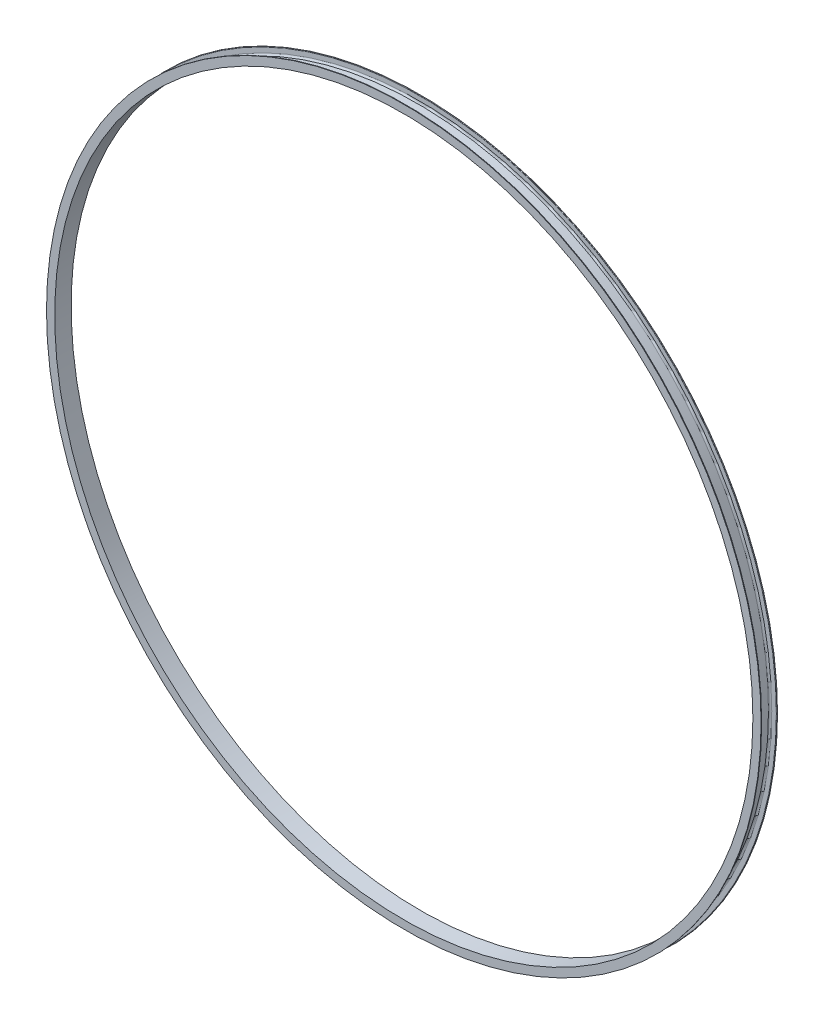
ISO-10303-21;
HEADER;
FILE_DESCRIPTION(('STEP AP214'),'2;1');
FILE_NAME('part.step','',(''),(''),'','','');
FILE_SCHEMA(('AUTOMOTIVE_DESIGN { 1 0 10303 214 1 1 1 1 }'));
ENDSEC;
DATA;
#1=APPLICATION_CONTEXT('core data for automotive mechanical design processes');
#2=APPLICATION_PROTOCOL_DEFINITION('international standard','automotive_design',2000,#1);
#3=PRODUCT_CONTEXT('',#1,'mechanical');
#4=PRODUCT('Part','Part','',(#3));
#5=PRODUCT_RELATED_PRODUCT_CATEGORY('part','',(#4));
#6=PRODUCT_DEFINITION_FORMATION('','',#4);
#7=PRODUCT_DEFINITION_CONTEXT('part definition',#1,'design');
#8=PRODUCT_DEFINITION('design','',#6,#7);
#9=PRODUCT_DEFINITION_SHAPE('','',#8);
#10=(LENGTH_UNIT() NAMED_UNIT(*) SI_UNIT(.MILLI.,.METRE.));
#11=(NAMED_UNIT(*) PLANE_ANGLE_UNIT() SI_UNIT($,.RADIAN.));
#12=(NAMED_UNIT(*) SI_UNIT($,.STERADIAN.) SOLID_ANGLE_UNIT());
#13=UNCERTAINTY_MEASURE_WITH_UNIT(LENGTH_MEASURE(1.E-05),#10,'distance_accuracy_value','');
#14=(GEOMETRIC_REPRESENTATION_CONTEXT(3) GLOBAL_UNCERTAINTY_ASSIGNED_CONTEXT((#13)) GLOBAL_UNIT_ASSIGNED_CONTEXT((#10,
#11,#12)) REPRESENTATION_CONTEXT('',''));
#15=CARTESIAN_POINT('',(0.,0.,0.));
#16=DIRECTION('',(0.,0.,1.));
#17=DIRECTION('',(1.,0.,0.));
#18=AXIS2_PLACEMENT_3D('',#15,#16,#17);
#19=CARTESIAN_POINT('',(0.,0.,0.));
#20=DIRECTION('',(0.,0.,1.));
#21=DIRECTION('',(1.,0.,0.));
#22=AXIS2_PLACEMENT_3D('',#19,#20,#21);
#23=CYLINDRICAL_SURFACE('',#22,850.);
#24=CARTESIAN_POINT('',(0.,0.,20.));
#25=DIRECTION('',(0.,0.,1.));
#26=DIRECTION('',(1.,0.,0.));
#27=AXIS2_PLACEMENT_3D('',#24,#25,#26);
#28=CIRCLE('',#27,850.);
#29=CARTESIAN_POINT('',(850.,0.,20.));
#30=VERTEX_POINT('',#29);
#31=EDGE_CURVE('E72',#30,#30,#28,.T.);
#32=ORIENTED_EDGE('',*,*,#31,.T.);
#33=EDGE_LOOP('',(#32));
#34=FACE_BOUND('',#33,.T.);
#35=CARTESIAN_POINT('',(0.,0.,-20.));
#36=DIRECTION('',(0.,0.,1.));
#37=DIRECTION('',(1.,0.,0.));
#38=AXIS2_PLACEMENT_3D('',#35,#36,#37);
#39=CIRCLE('',#38,850.);
#40=CARTESIAN_POINT('',(850.,0.,-20.));
#41=VERTEX_POINT('',#40);
#42=EDGE_CURVE('E10',#41,#41,#39,.T.);
#43=ORIENTED_EDGE('',*,*,#42,.F.);
#44=EDGE_LOOP('',(#43));
#45=FACE_BOUND('',#44,.T.);
#46=ADVANCED_FACE('F32',(#34,#45),#23,.F.);
#47=CARTESIAN_POINT('',(850.,0.,-20.));
#48=DIRECTION('',(0.,0.,-1.));
#49=DIRECTION('',(-1.,0.,0.));
#50=AXIS2_PLACEMENT_3D('',#47,#48,#49);
#51=PLANE('',#50);
#52=ORIENTED_EDGE('',*,*,#42,.T.);
#53=EDGE_LOOP('',(#52));
#54=FACE_BOUND('',#53,.T.);
#55=CARTESIAN_POINT('',(0.,0.,-20.));
#56=DIRECTION('',(0.,0.,1.));
#57=DIRECTION('',(1.,0.,0.));
#58=AXIS2_PLACEMENT_3D('',#55,#56,#57);
#59=CIRCLE('',#58,870.);
#60=CARTESIAN_POINT('',(870.,0.,-20.));
#61=VERTEX_POINT('',#60);
#62=EDGE_CURVE('E38',#61,#61,#59,.T.);
#63=ORIENTED_EDGE('',*,*,#62,.F.);
#64=EDGE_LOOP('',(#63));
#65=FACE_BOUND('',#64,.T.);
#66=ADVANCED_FACE('F90',(#54,#65),#51,.T.);
#67=CARTESIAN_POINT('',(0.,0.,0.));
#68=DIRECTION('',(0.,0.,1.));
#69=DIRECTION('',(1.,0.,0.));
#70=AXIS2_PLACEMENT_3D('',#67,#68,#69);
#71=CYLINDRICAL_SURFACE('',#70,870.);
#72=ORIENTED_EDGE('',*,*,#62,.T.);
#73=EDGE_LOOP('',(#72));
#74=FACE_BOUND('',#73,.T.);
#75=CARTESIAN_POINT('',(0.,0.,-19.));
#76=DIRECTION('',(0.,0.,1.));
#77=DIRECTION('',(1.,0.,0.));
#78=AXIS2_PLACEMENT_3D('',#75,#76,#77);
#79=CIRCLE('',#78,870.);
#80=CARTESIAN_POINT('',(870.,0.,-19.));
#81=VERTEX_POINT('',#80);
#82=EDGE_CURVE('E42',#81,#81,#79,.T.);
#83=ORIENTED_EDGE('',*,*,#82,.F.);
#84=EDGE_LOOP('',(#83));
#85=FACE_BOUND('',#84,.T.);
#86=ADVANCED_FACE('F94',(#74,#85),#71,.T.);
#87=CARTESIAN_POINT('',(0.,0.,-19.));
#88=DIRECTION('',(0.,0.,1.));
#89=DIRECTION('',(1.,0.,0.));
#90=AXIS2_PLACEMENT_3D('',#87,#88,#89);
#91=TOROIDAL_SURFACE('',#90,869.,1.);
#92=ORIENTED_EDGE('',*,*,#82,.T.);
#93=EDGE_LOOP('',(#92));
#94=FACE_BOUND('',#93,.T.);
#95=CARTESIAN_POINT('',(0.,0.,-18.));
#96=DIRECTION('',(0.,0.,1.));
#97=DIRECTION('',(1.,0.,0.));
#98=AXIS2_PLACEMENT_3D('',#95,#96,#97);
#99=CIRCLE('',#98,869.);
#100=CARTESIAN_POINT('',(869.,0.,-18.));
#101=VERTEX_POINT('',#100);
#102=EDGE_CURVE('E46',#101,#101,#99,.T.);
#103=ORIENTED_EDGE('',*,*,#102,.F.);
#104=EDGE_LOOP('',(#103));
#105=FACE_BOUND('',#104,.T.);
#106=ADVANCED_FACE('F98',(#94,#105),#91,.T.);
#107=CARTESIAN_POINT('',(869.,0.,-18.));
#108=DIRECTION('',(0.,0.,1.));
#109=DIRECTION('',(1.,0.,0.));
#110=AXIS2_PLACEMENT_3D('',#107,#108,#109);
#111=PLANE('',#110);
#112=ORIENTED_EDGE('',*,*,#102,.T.);
#113=EDGE_LOOP('',(#112));
#114=FACE_BOUND('',#113,.T.);
#115=CARTESIAN_POINT('',(0.,0.,-18.));
#116=DIRECTION('',(0.,0.,1.));
#117=DIRECTION('',(1.,0.,0.));
#118=AXIS2_PLACEMENT_3D('',#115,#116,#117);
#119=CIRCLE('',#118,858.);
#120=CARTESIAN_POINT('',(858.,0.,-18.));
#121=VERTEX_POINT('',#120);
#122=EDGE_CURVE('E51',#121,#121,#119,.T.);
#123=ORIENTED_EDGE('',*,*,#122,.F.);
#124=EDGE_LOOP('',(#123));
#125=FACE_BOUND('',#124,.T.);
#126=ADVANCED_FACE('F104',(#114,#125),#111,.T.);
#127=CARTESIAN_POINT('',(0.,0.,-14.));
#128=DIRECTION('',(0.,0.,1.));
#129=DIRECTION('',(1.,0.,0.));
#130=AXIS2_PLACEMENT_3D('',#127,#128,#129);
#131=TOROIDAL_SURFACE('',#130,858.,4.);
#132=ORIENTED_EDGE('',*,*,#122,.T.);
#133=EDGE_LOOP('',(#132));
#134=FACE_BOUND('',#133,.T.);
#135=CARTESIAN_POINT('',(0.,0.,-14.));
#136=DIRECTION('',(0.,0.,1.));
#137=DIRECTION('',(1.,0.,0.));
#138=AXIS2_PLACEMENT_3D('',#135,#136,#137);
#139=CIRCLE('',#138,854.);
#140=CARTESIAN_POINT('',(854.,0.,-14.));
#141=VERTEX_POINT('',#140);
#142=EDGE_CURVE('E54',#141,#141,#139,.T.);
#143=ORIENTED_EDGE('',*,*,#142,.F.);
#144=EDGE_LOOP('',(#143));
#145=FACE_BOUND('',#144,.T.);
#146=ADVANCED_FACE('F108',(#134,#145),#131,.F.);
#147=CARTESIAN_POINT('',(0.,0.,0.));
#148=DIRECTION('',(0.,0.,1.));
#149=DIRECTION('',(1.,0.,0.));
#150=AXIS2_PLACEMENT_3D('',#147,#148,#149);
#151=CYLINDRICAL_SURFACE('',#150,854.);
#152=ORIENTED_EDGE('',*,*,#142,.T.);
#153=EDGE_LOOP('',(#152));
#154=FACE_BOUND('',#153,.T.);
#155=CARTESIAN_POINT('',(0.,0.,14.));
#156=DIRECTION('',(0.,0.,1.));
#157=DIRECTION('',(1.,0.,0.));
#158=AXIS2_PLACEMENT_3D('',#155,#156,#157);
#159=CIRCLE('',#158,854.);
#160=CARTESIAN_POINT('',(854.,0.,14.));
#161=VERTEX_POINT('',#160);
#162=EDGE_CURVE('E57',#161,#161,#159,.T.);
#163=ORIENTED_EDGE('',*,*,#162,.F.);
#164=EDGE_LOOP('',(#163));
#165=FACE_BOUND('',#164,.T.);
#166=ADVANCED_FACE('F112',(#154,#165),#151,.T.);
#167=CARTESIAN_POINT('',(0.,0.,14.));
#168=DIRECTION('',(0.,0.,1.));
#169=DIRECTION('',(1.,0.,0.));
#170=AXIS2_PLACEMENT_3D('',#167,#168,#169);
#171=TOROIDAL_SURFACE('',#170,858.,4.);
#172=ORIENTED_EDGE('',*,*,#162,.T.);
#173=EDGE_LOOP('',(#172));
#174=FACE_BOUND('',#173,.T.);
#175=CARTESIAN_POINT('',(0.,0.,18.));
#176=DIRECTION('',(0.,0.,1.));
#177=DIRECTION('',(1.,0.,0.));
#178=AXIS2_PLACEMENT_3D('',#175,#176,#177);
#179=CIRCLE('',#178,858.);
#180=CARTESIAN_POINT('',(858.,0.,18.));
#181=VERTEX_POINT('',#180);
#182=EDGE_CURVE('E60',#181,#181,#179,.T.);
#183=ORIENTED_EDGE('',*,*,#182,.F.);
#184=EDGE_LOOP('',(#183));
#185=FACE_BOUND('',#184,.T.);
#186=ADVANCED_FACE('F116',(#174,#185),#171,.F.);
#187=CARTESIAN_POINT('',(869.,0.,18.));
#188=DIRECTION('',(0.,0.,-1.));
#189=DIRECTION('',(-1.,0.,0.));
#190=AXIS2_PLACEMENT_3D('',#187,#188,#189);
#191=PLANE('',#190);
#192=ORIENTED_EDGE('',*,*,#182,.T.);
#193=EDGE_LOOP('',(#192));
#194=FACE_BOUND('',#193,.T.);
#195=CARTESIAN_POINT('',(0.,0.,18.));
#196=DIRECTION('',(0.,0.,1.));
#197=DIRECTION('',(1.,0.,0.));
#198=AXIS2_PLACEMENT_3D('',#195,#196,#197);
#199=CIRCLE('',#198,869.);
#200=CARTESIAN_POINT('',(869.,0.,18.));
#201=VERTEX_POINT('',#200);
#202=EDGE_CURVE('E63',#201,#201,#199,.T.);
#203=ORIENTED_EDGE('',*,*,#202,.F.);
#204=EDGE_LOOP('',(#203));
#205=FACE_BOUND('',#204,.T.);
#206=ADVANCED_FACE('F120',(#194,#205),#191,.T.);
#207=CARTESIAN_POINT('',(0.,0.,19.));
#208=DIRECTION('',(0.,0.,1.));
#209=DIRECTION('',(1.,0.,0.));
#210=AXIS2_PLACEMENT_3D('',#207,#208,#209);
#211=TOROIDAL_SURFACE('',#210,869.,1.);
#212=ORIENTED_EDGE('',*,*,#202,.T.);
#213=EDGE_LOOP('',(#212));
#214=FACE_BOUND('',#213,.T.);
#215=CARTESIAN_POINT('',(0.,0.,19.));
#216=DIRECTION('',(0.,0.,1.));
#217=DIRECTION('',(1.,0.,0.));
#218=AXIS2_PLACEMENT_3D('',#215,#216,#217);
#219=CIRCLE('',#218,870.);
#220=CARTESIAN_POINT('',(870.,0.,19.));
#221=VERTEX_POINT('',#220);
#222=EDGE_CURVE('E66',#221,#221,#219,.T.);
#223=ORIENTED_EDGE('',*,*,#222,.F.);
#224=EDGE_LOOP('',(#223));
#225=FACE_BOUND('',#224,.T.);
#226=ADVANCED_FACE('F86',(#214,#225),#211,.T.);
#227=CARTESIAN_POINT('',(0.,0.,0.));
#228=DIRECTION('',(0.,0.,1.));
#229=DIRECTION('',(1.,0.,0.));
#230=AXIS2_PLACEMENT_3D('',#227,#228,#229);
#231=CYLINDRICAL_SURFACE('',#230,870.);
#232=ORIENTED_EDGE('',*,*,#222,.T.);
#233=EDGE_LOOP('',(#232));
#234=FACE_BOUND('',#233,.T.);
#235=CARTESIAN_POINT('',(0.,0.,20.));
#236=DIRECTION('',(0.,0.,1.));
#237=DIRECTION('',(1.,0.,0.));
#238=AXIS2_PLACEMENT_3D('',#235,#236,#237);
#239=CIRCLE('',#238,870.);
#240=CARTESIAN_POINT('',(870.,0.,20.));
#241=VERTEX_POINT('',#240);
#242=EDGE_CURVE('E69',#241,#241,#239,.T.);
#243=ORIENTED_EDGE('',*,*,#242,.F.);
#244=EDGE_LOOP('',(#243));
#245=FACE_BOUND('',#244,.T.);
#246=ADVANCED_FACE('F80',(#234,#245),#231,.T.);
#247=CARTESIAN_POINT('',(850.,0.,20.));
#248=DIRECTION('',(0.,0.,1.));
#249=DIRECTION('',(1.,0.,0.));
#250=AXIS2_PLACEMENT_3D('',#247,#248,#249);
#251=PLANE('',#250);
#252=ORIENTED_EDGE('',*,*,#242,.T.);
#253=EDGE_LOOP('',(#252));
#254=FACE_BOUND('',#253,.T.);
#255=ORIENTED_EDGE('',*,*,#31,.F.);
#256=EDGE_LOOP('',(#255));
#257=FACE_BOUND('',#256,.T.);
#258=ADVANCED_FACE('F78',(#254,#257),#251,.T.);
#259=CLOSED_SHELL('',(#46,#66,#86,#106,#126,#146,#166,#186,#206,#226,#246,#258));
#260=MANIFOLD_SOLID_BREP('B2',#259);
#261=ADVANCED_BREP_SHAPE_REPRESENTATION('',(#18,#260),#14);
#262=SHAPE_DEFINITION_REPRESENTATION(#9,#261);
ENDSEC;
END-ISO-10303-21;
